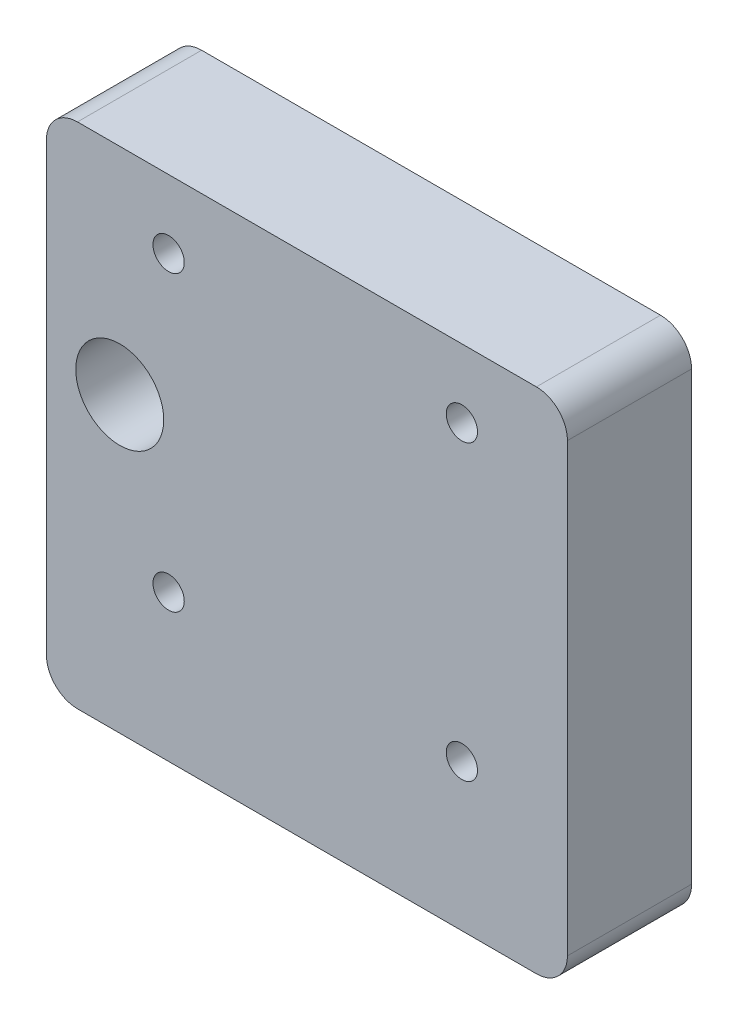
ISO-10303-21;
HEADER;
FILE_DESCRIPTION(('STEP AP214'),'2;1');
FILE_NAME('part.step','',(''),(''),'','','');
FILE_SCHEMA(('AUTOMOTIVE_DESIGN { 1 0 10303 214 1 1 1 1 }'));
ENDSEC;
DATA;
#1=APPLICATION_CONTEXT('core data for automotive mechanical design processes');
#2=APPLICATION_PROTOCOL_DEFINITION('international standard','automotive_design',2000,#1);
#3=PRODUCT_CONTEXT('',#1,'mechanical');
#4=PRODUCT('Part','Part','',(#3));
#5=PRODUCT_RELATED_PRODUCT_CATEGORY('part','',(#4));
#6=PRODUCT_DEFINITION_FORMATION('','',#4);
#7=PRODUCT_DEFINITION_CONTEXT('part definition',#1,'design');
#8=PRODUCT_DEFINITION('design','',#6,#7);
#9=PRODUCT_DEFINITION_SHAPE('','',#8);
#10=(LENGTH_UNIT() NAMED_UNIT(*) SI_UNIT(.MILLI.,.METRE.));
#11=(NAMED_UNIT(*) PLANE_ANGLE_UNIT() SI_UNIT($,.RADIAN.));
#12=(NAMED_UNIT(*) SI_UNIT($,.STERADIAN.) SOLID_ANGLE_UNIT());
#13=UNCERTAINTY_MEASURE_WITH_UNIT(LENGTH_MEASURE(1.E-05),#10,'distance_accuracy_value','');
#14=(GEOMETRIC_REPRESENTATION_CONTEXT(3) GLOBAL_UNCERTAINTY_ASSIGNED_CONTEXT((#13)) GLOBAL_UNIT_ASSIGNED_CONTEXT((#10,
#11,#12)) REPRESENTATION_CONTEXT('',''));
#15=CARTESIAN_POINT('',(0.,0.,0.));
#16=DIRECTION('',(0.,0.,1.));
#17=DIRECTION('',(1.,0.,0.));
#18=AXIS2_PLACEMENT_3D('',#15,#16,#17);
#19=CARTESIAN_POINT('',(0.,0.,12.7));
#20=DIRECTION('',(0.,0.,1.));
#21=DIRECTION('',(1.,0.,0.));
#22=AXIS2_PLACEMENT_3D('',#19,#20,#21);
#23=PLANE('',#22);
#24=DIRECTION('',(-1.,0.,0.));
#25=VECTOR('',#24,1.);
#26=CARTESIAN_POINT('',(0.,-52.,12.7));
#27=LINE('',#26,#25);
#28=CARTESIAN_POINT('',(45.125,-52.,12.7));
#29=VERTEX_POINT('',#28);
#30=CARTESIAN_POINT('',(-1.825,-52.,12.7));
#31=VERTEX_POINT('',#30);
#32=EDGE_CURVE('E120',#29,#31,#27,.T.);
#33=ORIENTED_EDGE('',*,*,#32,.F.);
#34=CARTESIAN_POINT('',(45.125,-48.825,12.7));
#35=DIRECTION('',(0.,0.,1.));
#36=DIRECTION('',(1.,0.,0.));
#37=AXIS2_PLACEMENT_3D('',#34,#35,#36);
#38=CIRCLE('',#37,3.175);
#39=CARTESIAN_POINT('',(48.3,-48.825,12.7));
#40=VERTEX_POINT('',#39);
#41=EDGE_CURVE('E240',#29,#40,#38,.T.);
#42=ORIENTED_EDGE('',*,*,#41,.T.);
#43=DIRECTION('',(0.,-1.,0.));
#44=VECTOR('',#43,1.);
#45=CARTESIAN_POINT('',(48.3,0.,12.7));
#46=LINE('',#45,#44);
#47=CARTESIAN_POINT('',(48.3,-3.175,12.7));
#48=VERTEX_POINT('',#47);
#49=EDGE_CURVE('E183',#48,#40,#46,.T.);
#50=ORIENTED_EDGE('',*,*,#49,.F.);
#51=CARTESIAN_POINT('',(45.125,-3.175,12.7));
#52=DIRECTION('',(0.,0.,1.));
#53=DIRECTION('',(1.,0.,0.));
#54=AXIS2_PLACEMENT_3D('',#51,#52,#53);
#55=CIRCLE('',#54,3.175);
#56=CARTESIAN_POINT('',(45.125,0.,12.7));
#57=VERTEX_POINT('',#56);
#58=EDGE_CURVE('E237',#48,#57,#55,.T.);
#59=ORIENTED_EDGE('',*,*,#58,.T.);
#60=DIRECTION('',(1.,0.,0.));
#61=VECTOR('',#60,1.);
#62=CARTESIAN_POINT('',(0.,0.,12.7));
#63=LINE('',#62,#61);
#64=CARTESIAN_POINT('',(-1.825,0.,12.7));
#65=VERTEX_POINT('',#64);
#66=EDGE_CURVE('E188',#65,#57,#63,.T.);
#67=ORIENTED_EDGE('',*,*,#66,.F.);
#68=CARTESIAN_POINT('',(-1.825,-3.175,12.7));
#69=DIRECTION('',(0.,0.,1.));
#70=DIRECTION('',(1.,0.,0.));
#71=AXIS2_PLACEMENT_3D('',#68,#69,#70);
#72=CIRCLE('',#71,3.175);
#73=CARTESIAN_POINT('',(-5.,-3.175,12.7));
#74=VERTEX_POINT('',#73);
#75=EDGE_CURVE('E170',#65,#74,#72,.T.);
#76=ORIENTED_EDGE('',*,*,#75,.T.);
#77=DIRECTION('',(0.,-1.,0.));
#78=VECTOR('',#77,1.);
#79=CARTESIAN_POINT('',(-5.,0.,12.7));
#80=LINE('',#79,#78);
#81=CARTESIAN_POINT('',(-4.99999999999999,-48.825,12.7));
#82=VERTEX_POINT('',#81);
#83=EDGE_CURVE('E164',#74,#82,#80,.T.);
#84=ORIENTED_EDGE('',*,*,#83,.T.);
#85=CARTESIAN_POINT('',(-1.825,-48.825,12.7));
#86=DIRECTION('',(0.,0.,1.));
#87=DIRECTION('',(1.,0.,0.));
#88=AXIS2_PLACEMENT_3D('',#85,#86,#87);
#89=CIRCLE('',#88,3.175);
#90=EDGE_CURVE('E168',#82,#31,#89,.T.);
#91=ORIENTED_EDGE('',*,*,#90,.T.);
#92=EDGE_LOOP('',(#33,#42,#50,#59,#67,#76,#84,#91));
#93=FACE_BOUND('',#92,.T.);
#94=CARTESIAN_POINT('',(7.5,-7.,12.7));
#95=DIRECTION('',(0.,0.,1.));
#96=DIRECTION('',(1.,0.,0.));
#97=AXIS2_PLACEMENT_3D('',#94,#95,#96);
#98=CIRCLE('',#97,1.6);
#99=CARTESIAN_POINT('',(9.1,-7.,12.7));
#100=VERTEX_POINT('',#99);
#101=EDGE_CURVE('E192',#100,#100,#98,.T.);
#102=ORIENTED_EDGE('',*,*,#101,.F.);
#103=EDGE_LOOP('',(#102));
#104=FACE_BOUND('',#103,.T.);
#105=CARTESIAN_POINT('',(37.5,-7.,12.7));
#106=DIRECTION('',(0.,0.,1.));
#107=DIRECTION('',(1.,0.,0.));
#108=AXIS2_PLACEMENT_3D('',#105,#106,#107);
#109=CIRCLE('',#108,1.6);
#110=CARTESIAN_POINT('',(39.1,-7.,12.7));
#111=VERTEX_POINT('',#110);
#112=EDGE_CURVE('E196',#111,#111,#109,.T.);
#113=ORIENTED_EDGE('',*,*,#112,.F.);
#114=EDGE_LOOP('',(#113));
#115=FACE_BOUND('',#114,.T.);
#116=CARTESIAN_POINT('',(37.5,-37.,12.7));
#117=DIRECTION('',(0.,0.,1.));
#118=DIRECTION('',(1.,0.,0.));
#119=AXIS2_PLACEMENT_3D('',#116,#117,#118);
#120=CIRCLE('',#119,1.60000000000001);
#121=CARTESIAN_POINT('',(39.1,-37.,12.7));
#122=VERTEX_POINT('',#121);
#123=EDGE_CURVE('E200',#122,#122,#120,.T.);
#124=ORIENTED_EDGE('',*,*,#123,.F.);
#125=EDGE_LOOP('',(#124));
#126=FACE_BOUND('',#125,.T.);
#127=CARTESIAN_POINT('',(7.5,-37.,12.7));
#128=DIRECTION('',(0.,0.,1.));
#129=DIRECTION('',(1.,0.,0.));
#130=AXIS2_PLACEMENT_3D('',#127,#128,#129);
#131=CIRCLE('',#130,1.6);
#132=CARTESIAN_POINT('',(9.1,-37.,12.7));
#133=VERTEX_POINT('',#132);
#134=EDGE_CURVE('E125',#133,#133,#131,.T.);
#135=ORIENTED_EDGE('',*,*,#134,.F.);
#136=EDGE_LOOP('',(#135));
#137=FACE_BOUND('',#136,.T.);
#138=CARTESIAN_POINT('',(2.5,-22.,12.7));
#139=DIRECTION('',(0.,0.,1.));
#140=DIRECTION('',(1.,0.,0.));
#141=AXIS2_PLACEMENT_3D('',#138,#139,#140);
#142=CIRCLE('',#141,4.5);
#143=CARTESIAN_POINT('',(7.00000000000001,-22.,12.7));
#144=VERTEX_POINT('',#143);
#145=EDGE_CURVE('E179',#144,#144,#142,.T.);
#146=ORIENTED_EDGE('',*,*,#145,.F.);
#147=EDGE_LOOP('',(#146));
#148=FACE_BOUND('',#147,.T.);
#149=ADVANCED_FACE('F44',(#93,#104,#115,#126,#137,#148),#23,.T.);
#150=CARTESIAN_POINT('',(0.,0.,0.));
#151=DIRECTION('',(0.,0.,1.));
#152=DIRECTION('',(1.,0.,0.));
#153=AXIS2_PLACEMENT_3D('',#150,#151,#152);
#154=PLANE('',#153);
#155=CARTESIAN_POINT('',(7.5,-37.,0.));
#156=DIRECTION('',(0.,0.,1.));
#157=DIRECTION('',(1.,0.,0.));
#158=AXIS2_PLACEMENT_3D('',#155,#156,#157);
#159=CIRCLE('',#158,1.6);
#160=CARTESIAN_POINT('',(9.1,-37.,0.));
#161=VERTEX_POINT('',#160);
#162=EDGE_CURVE('E184',#161,#161,#159,.T.);
#163=ORIENTED_EDGE('',*,*,#162,.T.);
#164=EDGE_LOOP('',(#163));
#165=FACE_BOUND('',#164,.T.);
#166=CARTESIAN_POINT('',(37.5,-37.,0.));
#167=DIRECTION('',(0.,0.,1.));
#168=DIRECTION('',(1.,0.,0.));
#169=AXIS2_PLACEMENT_3D('',#166,#167,#168);
#170=CIRCLE('',#169,1.60000000000001);
#171=CARTESIAN_POINT('',(39.1,-37.,0.));
#172=VERTEX_POINT('',#171);
#173=EDGE_CURVE('E224',#172,#172,#170,.T.);
#174=ORIENTED_EDGE('',*,*,#173,.T.);
#175=EDGE_LOOP('',(#174));
#176=FACE_BOUND('',#175,.T.);
#177=CARTESIAN_POINT('',(37.5,-7.,0.));
#178=DIRECTION('',(0.,0.,1.));
#179=DIRECTION('',(1.,0.,0.));
#180=AXIS2_PLACEMENT_3D('',#177,#178,#179);
#181=CIRCLE('',#180,1.6);
#182=CARTESIAN_POINT('',(39.1,-7.,0.));
#183=VERTEX_POINT('',#182);
#184=EDGE_CURVE('E220',#183,#183,#181,.T.);
#185=ORIENTED_EDGE('',*,*,#184,.T.);
#186=EDGE_LOOP('',(#185));
#187=FACE_BOUND('',#186,.T.);
#188=CARTESIAN_POINT('',(7.5,-7.,0.));
#189=DIRECTION('',(0.,0.,1.));
#190=DIRECTION('',(1.,0.,0.));
#191=AXIS2_PLACEMENT_3D('',#188,#189,#190);
#192=CIRCLE('',#191,1.6);
#193=CARTESIAN_POINT('',(9.1,-7.,0.));
#194=VERTEX_POINT('',#193);
#195=EDGE_CURVE('E216',#194,#194,#192,.T.);
#196=ORIENTED_EDGE('',*,*,#195,.T.);
#197=EDGE_LOOP('',(#196));
#198=FACE_BOUND('',#197,.T.);
#199=DIRECTION('',(0.,-1.,0.));
#200=VECTOR('',#199,1.);
#201=CARTESIAN_POINT('',(48.3,0.,0.));
#202=LINE('',#201,#200);
#203=CARTESIAN_POINT('',(48.3,-3.175,0.));
#204=VERTEX_POINT('',#203);
#205=CARTESIAN_POINT('',(48.3,-48.825,0.));
#206=VERTEX_POINT('',#205);
#207=EDGE_CURVE('E210',#204,#206,#202,.T.);
#208=ORIENTED_EDGE('',*,*,#207,.T.);
#209=CARTESIAN_POINT('',(45.125,-48.825,0.));
#210=DIRECTION('',(0.,0.,1.));
#211=DIRECTION('',(1.,0.,0.));
#212=AXIS2_PLACEMENT_3D('',#209,#210,#211);
#213=CIRCLE('',#212,3.175);
#214=CARTESIAN_POINT('',(45.125,-52.,0.));
#215=VERTEX_POINT('',#214);
#216=EDGE_CURVE('E133',#206,#215,#213,.F.);
#217=ORIENTED_EDGE('',*,*,#216,.T.);
#218=DIRECTION('',(1.,0.,0.));
#219=VECTOR('',#218,1.);
#220=CARTESIAN_POINT('',(0.,-52.,0.));
#221=LINE('',#220,#219);
#222=CARTESIAN_POINT('',(-1.825,-52.,0.));
#223=VERTEX_POINT('',#222);
#224=EDGE_CURVE('E117',#223,#215,#221,.T.);
#225=ORIENTED_EDGE('',*,*,#224,.F.);
#226=CARTESIAN_POINT('',(-1.825,-48.825,0.));
#227=DIRECTION('',(0.,0.,1.));
#228=DIRECTION('',(1.,0.,0.));
#229=AXIS2_PLACEMENT_3D('',#226,#227,#228);
#230=CIRCLE('',#229,3.175);
#231=CARTESIAN_POINT('',(-4.99999999999999,-48.825,0.));
#232=VERTEX_POINT('',#231);
#233=EDGE_CURVE('E130',#223,#232,#230,.F.);
#234=ORIENTED_EDGE('',*,*,#233,.T.);
#235=DIRECTION('',(0.,1.,0.));
#236=VECTOR('',#235,1.);
#237=CARTESIAN_POINT('',(-5.,0.,0.));
#238=LINE('',#237,#236);
#239=CARTESIAN_POINT('',(-5.,-3.175,0.));
#240=VERTEX_POINT('',#239);
#241=EDGE_CURVE('E135',#232,#240,#238,.T.);
#242=ORIENTED_EDGE('',*,*,#241,.T.);
#243=CARTESIAN_POINT('',(-1.825,-3.175,0.));
#244=DIRECTION('',(0.,0.,1.));
#245=DIRECTION('',(1.,0.,0.));
#246=AXIS2_PLACEMENT_3D('',#243,#244,#245);
#247=CIRCLE('',#246,3.175);
#248=CARTESIAN_POINT('',(-1.825,0.,0.));
#249=VERTEX_POINT('',#248);
#250=EDGE_CURVE('E68',#240,#249,#247,.F.);
#251=ORIENTED_EDGE('',*,*,#250,.T.);
#252=DIRECTION('',(1.,0.,0.));
#253=VECTOR('',#252,1.);
#254=CARTESIAN_POINT('',(0.,0.,0.));
#255=LINE('',#254,#253);
#256=CARTESIAN_POINT('',(45.125,0.,0.));
#257=VERTEX_POINT('',#256);
#258=EDGE_CURVE('E213',#249,#257,#255,.T.);
#259=ORIENTED_EDGE('',*,*,#258,.T.);
#260=CARTESIAN_POINT('',(45.125,-3.175,0.));
#261=DIRECTION('',(0.,0.,1.));
#262=DIRECTION('',(1.,0.,0.));
#263=AXIS2_PLACEMENT_3D('',#260,#261,#262);
#264=CIRCLE('',#263,3.175);
#265=EDGE_CURVE('E60',#257,#204,#264,.F.);
#266=ORIENTED_EDGE('',*,*,#265,.T.);
#267=EDGE_LOOP('',(#208,#217,#225,#234,#242,#251,#259,#266));
#268=FACE_BOUND('',#267,.T.);
#269=CARTESIAN_POINT('',(2.5,-22.,0.));
#270=DIRECTION('',(0.,0.,1.));
#271=DIRECTION('',(1.,0.,0.));
#272=AXIS2_PLACEMENT_3D('',#269,#270,#271);
#273=CIRCLE('',#272,4.5);
#274=CARTESIAN_POINT('',(7.00000000000001,-22.,0.));
#275=VERTEX_POINT('',#274);
#276=EDGE_CURVE('E178',#275,#275,#273,.T.);
#277=ORIENTED_EDGE('',*,*,#276,.T.);
#278=EDGE_LOOP('',(#277));
#279=FACE_BOUND('',#278,.T.);
#280=ADVANCED_FACE('F128',(#165,#176,#187,#198,#268,#279),#154,.F.);
#281=CARTESIAN_POINT('',(2.5,-22.,12.7));
#282=DIRECTION('',(0.,0.,-1.));
#283=DIRECTION('',(-1.,0.,0.));
#284=AXIS2_PLACEMENT_3D('',#281,#282,#283);
#285=CYLINDRICAL_SURFACE('',#284,4.5);
#286=ORIENTED_EDGE('',*,*,#276,.F.);
#287=EDGE_LOOP('',(#286));
#288=FACE_BOUND('',#287,.T.);
#289=ORIENTED_EDGE('',*,*,#145,.T.);
#290=EDGE_LOOP('',(#289));
#291=FACE_BOUND('',#290,.T.);
#292=ADVANCED_FACE('F272',(#288,#291),#285,.F.);
#293=CARTESIAN_POINT('',(48.3,0.,12.7));
#294=DIRECTION('',(1.,0.,0.));
#295=DIRECTION('',(0.,1.,0.));
#296=AXIS2_PLACEMENT_3D('',#293,#294,#295);
#297=PLANE('',#296);
#298=ORIENTED_EDGE('',*,*,#49,.T.);
#299=DIRECTION('',(0.,0.,1.));
#300=VECTOR('',#299,1.);
#301=CARTESIAN_POINT('',(48.3,-48.825,0.));
#302=LINE('',#301,#300);
#303=EDGE_CURVE('E140',#40,#206,#302,.F.);
#304=ORIENTED_EDGE('',*,*,#303,.T.);
#305=ORIENTED_EDGE('',*,*,#207,.F.);
#306=DIRECTION('',(0.,0.,-1.));
#307=VECTOR('',#306,1.);
#308=CARTESIAN_POINT('',(48.3,-3.175,12.7));
#309=LINE('',#308,#307);
#310=EDGE_CURVE('E145',#204,#48,#309,.F.);
#311=ORIENTED_EDGE('',*,*,#310,.T.);
#312=EDGE_LOOP('',(#298,#304,#305,#311));
#313=FACE_BOUND('',#312,.T.);
#314=ADVANCED_FACE('F246',(#313),#297,.T.);
#315=CARTESIAN_POINT('',(0.,0.,12.7));
#316=DIRECTION('',(0.,1.,0.));
#317=DIRECTION('',(0.,0.,1.));
#318=AXIS2_PLACEMENT_3D('',#315,#316,#317);
#319=PLANE('',#318);
#320=ORIENTED_EDGE('',*,*,#66,.T.);
#321=DIRECTION('',(0.,0.,-1.));
#322=VECTOR('',#321,1.);
#323=CARTESIAN_POINT('',(45.125,0.,12.7));
#324=LINE('',#323,#322);
#325=EDGE_CURVE('E157',#57,#257,#324,.T.);
#326=ORIENTED_EDGE('',*,*,#325,.T.);
#327=ORIENTED_EDGE('',*,*,#258,.F.);
#328=DIRECTION('',(0.,0.,1.));
#329=VECTOR('',#328,1.);
#330=CARTESIAN_POINT('',(-1.825,0.,12.7));
#331=LINE('',#330,#329);
#332=EDGE_CURVE('E153',#249,#65,#331,.T.);
#333=ORIENTED_EDGE('',*,*,#332,.T.);
#334=EDGE_LOOP('',(#320,#326,#327,#333));
#335=FACE_BOUND('',#334,.T.);
#336=ADVANCED_FACE('F251',(#335),#319,.T.);
#337=CARTESIAN_POINT('',(37.5,-37.,12.7));
#338=DIRECTION('',(0.,0.,-1.));
#339=DIRECTION('',(-1.,0.,0.));
#340=AXIS2_PLACEMENT_3D('',#337,#338,#339);
#341=CYLINDRICAL_SURFACE('',#340,1.60000000000001);
#342=ORIENTED_EDGE('',*,*,#123,.T.);
#343=EDGE_LOOP('',(#342));
#344=FACE_BOUND('',#343,.T.);
#345=ORIENTED_EDGE('',*,*,#173,.F.);
#346=EDGE_LOOP('',(#345));
#347=FACE_BOUND('',#346,.T.);
#348=ADVANCED_FACE('F282',(#344,#347),#341,.F.);
#349=CARTESIAN_POINT('',(37.5,-7.,12.7));
#350=DIRECTION('',(0.,0.,-1.));
#351=DIRECTION('',(-1.,0.,0.));
#352=AXIS2_PLACEMENT_3D('',#349,#350,#351);
#353=CYLINDRICAL_SURFACE('',#352,1.6);
#354=ORIENTED_EDGE('',*,*,#112,.T.);
#355=EDGE_LOOP('',(#354));
#356=FACE_BOUND('',#355,.T.);
#357=ORIENTED_EDGE('',*,*,#184,.F.);
#358=EDGE_LOOP('',(#357));
#359=FACE_BOUND('',#358,.T.);
#360=ADVANCED_FACE('F285',(#356,#359),#353,.F.);
#361=CARTESIAN_POINT('',(7.5,-7.,12.7));
#362=DIRECTION('',(0.,0.,-1.));
#363=DIRECTION('',(-1.,0.,0.));
#364=AXIS2_PLACEMENT_3D('',#361,#362,#363);
#365=CYLINDRICAL_SURFACE('',#364,1.6);
#366=ORIENTED_EDGE('',*,*,#101,.T.);
#367=EDGE_LOOP('',(#366));
#368=FACE_BOUND('',#367,.T.);
#369=ORIENTED_EDGE('',*,*,#195,.F.);
#370=EDGE_LOOP('',(#369));
#371=FACE_BOUND('',#370,.T.);
#372=ADVANCED_FACE('F280',(#368,#371),#365,.F.);
#373=CARTESIAN_POINT('',(7.5,-37.,12.7));
#374=DIRECTION('',(0.,0.,-1.));
#375=DIRECTION('',(-1.,0.,0.));
#376=AXIS2_PLACEMENT_3D('',#373,#374,#375);
#377=CYLINDRICAL_SURFACE('',#376,1.6);
#378=ORIENTED_EDGE('',*,*,#134,.T.);
#379=EDGE_LOOP('',(#378));
#380=FACE_BOUND('',#379,.T.);
#381=ORIENTED_EDGE('',*,*,#162,.F.);
#382=EDGE_LOOP('',(#381));
#383=FACE_BOUND('',#382,.T.);
#384=ADVANCED_FACE('F277',(#380,#383),#377,.F.);
#385=CARTESIAN_POINT('',(0.,-52.,-74.4640181564224));
#386=DIRECTION('',(0.,1.,0.));
#387=DIRECTION('',(0.,0.,1.));
#388=AXIS2_PLACEMENT_3D('',#385,#386,#387);
#389=PLANE('',#388);
#390=ORIENTED_EDGE('',*,*,#224,.T.);
#391=DIRECTION('',(0.,0.,1.));
#392=VECTOR('',#391,1.);
#393=CARTESIAN_POINT('',(45.125,-52.,12.7));
#394=LINE('',#393,#392);
#395=EDGE_CURVE('E124',#215,#29,#394,.T.);
#396=ORIENTED_EDGE('',*,*,#395,.T.);
#397=ORIENTED_EDGE('',*,*,#32,.T.);
#398=DIRECTION('',(0.,0.,1.));
#399=VECTOR('',#398,1.);
#400=CARTESIAN_POINT('',(-1.825,-52.,0.));
#401=LINE('',#400,#399);
#402=EDGE_CURVE('E113',#31,#223,#401,.F.);
#403=ORIENTED_EDGE('',*,*,#402,.T.);
#404=EDGE_LOOP('',(#390,#396,#397,#403));
#405=FACE_BOUND('',#404,.T.);
#406=ADVANCED_FACE('F115',(#405),#389,.F.);
#407=CARTESIAN_POINT('',(-5.,0.,-74.4640181564224));
#408=DIRECTION('',(-1.,0.,0.));
#409=DIRECTION('',(0.,-1.,0.));
#410=AXIS2_PLACEMENT_3D('',#407,#408,#409);
#411=PLANE('',#410);
#412=ORIENTED_EDGE('',*,*,#83,.F.);
#413=DIRECTION('',(0.,0.,1.));
#414=VECTOR('',#413,1.);
#415=CARTESIAN_POINT('',(-5.,-3.175,-74.4640181564224));
#416=LINE('',#415,#414);
#417=EDGE_CURVE('E11',#74,#240,#416,.F.);
#418=ORIENTED_EDGE('',*,*,#417,.T.);
#419=ORIENTED_EDGE('',*,*,#241,.F.);
#420=DIRECTION('',(0.,0.,1.));
#421=VECTOR('',#420,1.);
#422=CARTESIAN_POINT('',(-4.99999999999999,-48.825,12.7));
#423=LINE('',#422,#421);
#424=EDGE_CURVE('E53',#232,#82,#423,.T.);
#425=ORIENTED_EDGE('',*,*,#424,.T.);
#426=EDGE_LOOP('',(#412,#418,#419,#425));
#427=FACE_BOUND('',#426,.T.);
#428=ADVANCED_FACE('F163',(#427),#411,.T.);
#429=CARTESIAN_POINT('',(45.125,-48.825,-74.4640181564224));
#430=DIRECTION('',(0.,0.,-1.));
#431=DIRECTION('',(-1.,0.,0.));
#432=AXIS2_PLACEMENT_3D('',#429,#430,#431);
#433=CYLINDRICAL_SURFACE('',#432,3.175);
#434=ORIENTED_EDGE('',*,*,#216,.F.);
#435=ORIENTED_EDGE('',*,*,#303,.F.);
#436=ORIENTED_EDGE('',*,*,#41,.F.);
#437=ORIENTED_EDGE('',*,*,#395,.F.);
#438=EDGE_LOOP('',(#434,#435,#436,#437));
#439=FACE_BOUND('',#438,.T.);
#440=ADVANCED_FACE('F254',(#439),#433,.T.);
#441=CARTESIAN_POINT('',(45.125,-3.175,12.7));
#442=DIRECTION('',(0.,0.,-1.));
#443=DIRECTION('',(-1.,0.,0.));
#444=AXIS2_PLACEMENT_3D('',#441,#442,#443);
#445=CYLINDRICAL_SURFACE('',#444,3.175);
#446=ORIENTED_EDGE('',*,*,#58,.F.);
#447=ORIENTED_EDGE('',*,*,#310,.F.);
#448=ORIENTED_EDGE('',*,*,#265,.F.);
#449=ORIENTED_EDGE('',*,*,#325,.F.);
#450=EDGE_LOOP('',(#446,#447,#448,#449));
#451=FACE_BOUND('',#450,.T.);
#452=ADVANCED_FACE('F249',(#451),#445,.T.);
#453=CARTESIAN_POINT('',(-1.825,-3.175,12.7));
#454=DIRECTION('',(0.,0.,1.));
#455=DIRECTION('',(1.,0.,0.));
#456=AXIS2_PLACEMENT_3D('',#453,#454,#455);
#457=CYLINDRICAL_SURFACE('',#456,3.175);
#458=ORIENTED_EDGE('',*,*,#250,.F.);
#459=ORIENTED_EDGE('',*,*,#417,.F.);
#460=ORIENTED_EDGE('',*,*,#75,.F.);
#461=ORIENTED_EDGE('',*,*,#332,.F.);
#462=EDGE_LOOP('',(#458,#459,#460,#461));
#463=FACE_BOUND('',#462,.T.);
#464=ADVANCED_FACE('F261',(#463),#457,.T.);
#465=CARTESIAN_POINT('',(-1.825,-48.825,-74.4640181564224));
#466=DIRECTION('',(0.,0.,-1.));
#467=DIRECTION('',(-1.,0.,0.));
#468=AXIS2_PLACEMENT_3D('',#465,#466,#467);
#469=CYLINDRICAL_SURFACE('',#468,3.175);
#470=ORIENTED_EDGE('',*,*,#233,.F.);
#471=ORIENTED_EDGE('',*,*,#402,.F.);
#472=ORIENTED_EDGE('',*,*,#90,.F.);
#473=ORIENTED_EDGE('',*,*,#424,.F.);
#474=EDGE_LOOP('',(#470,#471,#472,#473));
#475=FACE_BOUND('',#474,.T.);
#476=ADVANCED_FACE('F46',(#475),#469,.T.);
#477=CLOSED_SHELL('',(#149,#280,#292,#314,#336,#348,#360,#372,#384,#406,#428,#440,#452,#464,#476));
#478=MANIFOLD_SOLID_BREP('B2',#477);
#479=ADVANCED_BREP_SHAPE_REPRESENTATION('',(#18,#478),#14);
#480=SHAPE_DEFINITION_REPRESENTATION(#9,#479);
ENDSEC;
END-ISO-10303-21;
